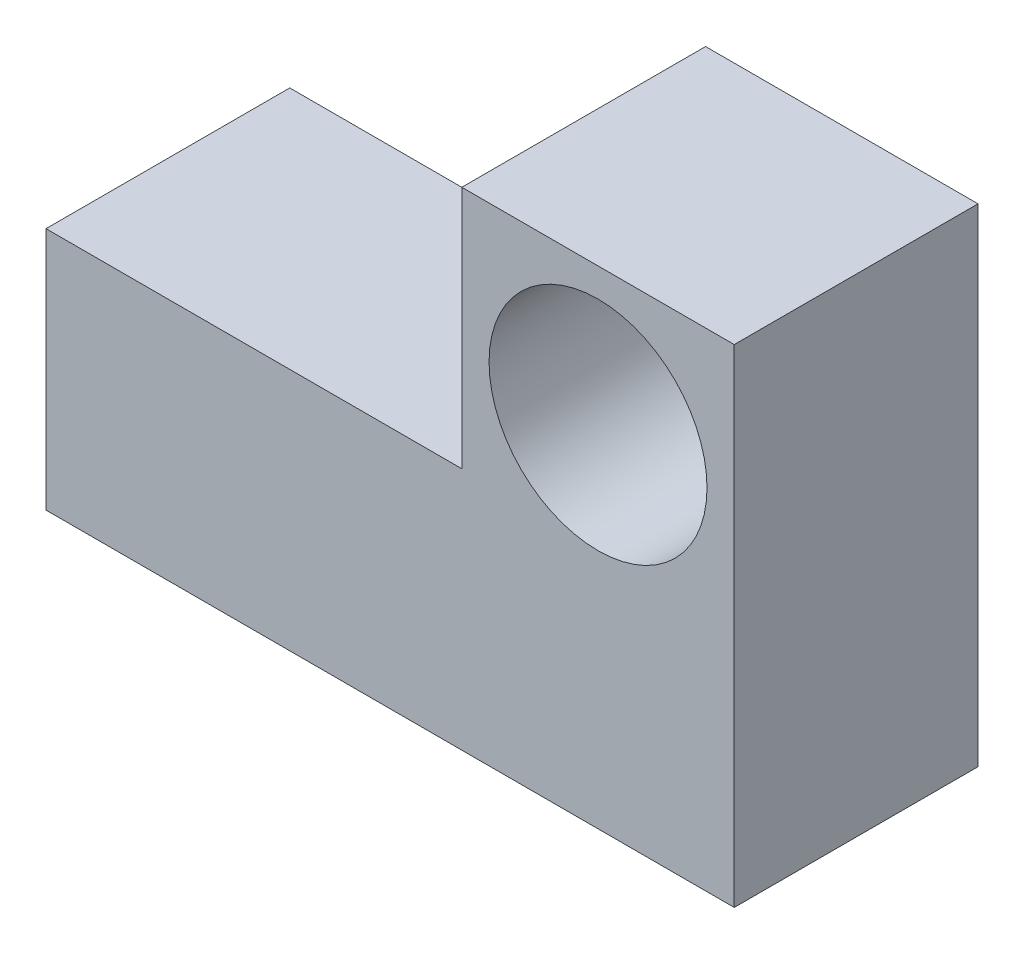
ISO-10303-21;
HEADER;
FILE_DESCRIPTION(('STEP AP214'),'2;1');
FILE_NAME('part.step','',(''),(''),'','','');
FILE_SCHEMA(('AUTOMOTIVE_DESIGN { 1 0 10303 214 1 1 1 1 }'));
ENDSEC;
DATA;
#1=APPLICATION_CONTEXT('core data for automotive mechanical design processes');
#2=APPLICATION_PROTOCOL_DEFINITION('international standard','automotive_design',2000,#1);
#3=PRODUCT_CONTEXT('',#1,'mechanical');
#4=PRODUCT('Part','Part','',(#3));
#5=PRODUCT_RELATED_PRODUCT_CATEGORY('part','',(#4));
#6=PRODUCT_DEFINITION_FORMATION('','',#4);
#7=PRODUCT_DEFINITION_CONTEXT('part definition',#1,'design');
#8=PRODUCT_DEFINITION('design','',#6,#7);
#9=PRODUCT_DEFINITION_SHAPE('','',#8);
#10=(LENGTH_UNIT() NAMED_UNIT(*) SI_UNIT(.MILLI.,.METRE.));
#11=(NAMED_UNIT(*) PLANE_ANGLE_UNIT() SI_UNIT($,.RADIAN.));
#12=(NAMED_UNIT(*) SI_UNIT($,.STERADIAN.) SOLID_ANGLE_UNIT());
#13=UNCERTAINTY_MEASURE_WITH_UNIT(LENGTH_MEASURE(1.E-05),#10,'distance_accuracy_value','');
#14=(GEOMETRIC_REPRESENTATION_CONTEXT(3) GLOBAL_UNCERTAINTY_ASSIGNED_CONTEXT((#13)) GLOBAL_UNIT_ASSIGNED_CONTEXT((#10,
#11,#12)) REPRESENTATION_CONTEXT('',''));
#15=CARTESIAN_POINT('',(0.,0.,0.));
#16=DIRECTION('',(0.,0.,1.));
#17=DIRECTION('',(1.,0.,0.));
#18=AXIS2_PLACEMENT_3D('',#15,#16,#17);
#19=CARTESIAN_POINT('',(0.,10.795,0.));
#20=DIRECTION('',(0.,-1.,0.));
#21=DIRECTION('',(0.,0.,-1.));
#22=AXIS2_PLACEMENT_3D('',#19,#20,#21);
#23=PLANE('',#22);
#24=DIRECTION('',(0.,0.,1.));
#25=VECTOR('',#24,1.);
#26=CARTESIAN_POINT('',(3.175,10.795,-5.3975));
#27=LINE('',#26,#25);
#28=CARTESIAN_POINT('',(3.17499999999999,10.795,-5.3975));
#29=VERTEX_POINT('',#28);
#30=CARTESIAN_POINT('',(3.175,10.795,5.3975));
#31=VERTEX_POINT('',#30);
#32=EDGE_CURVE('E49',#29,#31,#27,.T.);
#33=ORIENTED_EDGE('',*,*,#32,.F.);
#34=DIRECTION('',(-1.,0.,0.));
#35=VECTOR('',#34,1.);
#36=CARTESIAN_POINT('',(-15.24,10.795,-5.3975));
#37=LINE('',#36,#35);
#38=CARTESIAN_POINT('',(-15.24,10.795,-5.3975));
#39=VERTEX_POINT('',#38);
#40=EDGE_CURVE('E86',#29,#39,#37,.T.);
#41=ORIENTED_EDGE('',*,*,#40,.T.);
#42=DIRECTION('',(0.,0.,1.));
#43=VECTOR('',#42,1.);
#44=CARTESIAN_POINT('',(-15.24,10.795,5.3975));
#45=LINE('',#44,#43);
#46=CARTESIAN_POINT('',(-15.24,10.795,5.3975));
#47=VERTEX_POINT('',#46);
#48=EDGE_CURVE('E55',#39,#47,#45,.T.);
#49=ORIENTED_EDGE('',*,*,#48,.T.);
#50=DIRECTION('',(1.,0.,0.));
#51=VECTOR('',#50,1.);
#52=CARTESIAN_POINT('',(-15.24,10.795,5.3975));
#53=LINE('',#52,#51);
#54=EDGE_CURVE('E96',#47,#31,#53,.T.);
#55=ORIENTED_EDGE('',*,*,#54,.T.);
#56=EDGE_LOOP('',(#33,#41,#49,#55));
#57=FACE_BOUND('',#56,.T.);
#58=ADVANCED_FACE('F33',(#57),#23,.F.);
#59=CARTESIAN_POINT('',(15.24,10.795,5.3975));
#60=DIRECTION('',(-1.,0.,0.));
#61=DIRECTION('',(0.,0.,1.));
#62=AXIS2_PLACEMENT_3D('',#59,#60,#61);
#63=PLANE('',#62);
#64=DIRECTION('',(0.,0.,-1.));
#65=VECTOR('',#64,1.);
#66=CARTESIAN_POINT('',(15.24,0.,5.3975));
#67=LINE('',#66,#65);
#68=CARTESIAN_POINT('',(15.24,0.,5.3975));
#69=VERTEX_POINT('',#68);
#70=CARTESIAN_POINT('',(15.24,0.,-5.3975));
#71=VERTEX_POINT('',#70);
#72=EDGE_CURVE('E93',#69,#71,#67,.T.);
#73=ORIENTED_EDGE('',*,*,#72,.T.);
#74=DIRECTION('',(0.,-1.,0.));
#75=VECTOR('',#74,1.);
#76=CARTESIAN_POINT('',(15.24,10.795,-5.3975));
#77=LINE('',#76,#75);
#78=CARTESIAN_POINT('',(15.24,21.59,-5.3975));
#79=VERTEX_POINT('',#78);
#80=EDGE_CURVE('E11',#79,#71,#77,.T.);
#81=ORIENTED_EDGE('',*,*,#80,.F.);
#82=DIRECTION('',(0.,0.,-1.));
#83=VECTOR('',#82,1.);
#84=CARTESIAN_POINT('',(15.24,21.59,-5.3975));
#85=LINE('',#84,#83);
#86=CARTESIAN_POINT('',(15.24,21.59,5.3975));
#87=VERTEX_POINT('',#86);
#88=EDGE_CURVE('E95',#87,#79,#85,.T.);
#89=ORIENTED_EDGE('',*,*,#88,.F.);
#90=DIRECTION('',(0.,-1.,0.));
#91=VECTOR('',#90,1.);
#92=CARTESIAN_POINT('',(15.24,10.795,5.3975));
#93=LINE('',#92,#91);
#94=EDGE_CURVE('E79',#87,#69,#93,.T.);
#95=ORIENTED_EDGE('',*,*,#94,.T.);
#96=EDGE_LOOP('',(#73,#81,#89,#95));
#97=FACE_BOUND('',#96,.T.);
#98=ADVANCED_FACE('F35',(#97),#63,.F.);
#99=CARTESIAN_POINT('',(-15.24,10.795,-5.3975));
#100=DIRECTION('',(0.,0.,1.));
#101=DIRECTION('',(1.,0.,0.));
#102=AXIS2_PLACEMENT_3D('',#99,#100,#101);
#103=PLANE('',#102);
#104=CARTESIAN_POINT('',(9.2075,15.494,-5.3975));
#105=DIRECTION('',(0.,0.,-1.));
#106=DIRECTION('',(-1.,0.,0.));
#107=AXIS2_PLACEMENT_3D('',#104,#105,#106);
#108=CIRCLE('',#107,4.826);
#109=CARTESIAN_POINT('',(4.3815,15.494,-5.3975));
#110=VERTEX_POINT('',#109);
#111=EDGE_CURVE('E173',#110,#110,#108,.T.);
#112=ORIENTED_EDGE('',*,*,#111,.F.);
#113=EDGE_LOOP('',(#112));
#114=FACE_BOUND('',#113,.T.);
#115=DIRECTION('',(-1.,0.,0.));
#116=VECTOR('',#115,1.);
#117=CARTESIAN_POINT('',(-15.24,0.,-5.3975));
#118=LINE('',#117,#116);
#119=CARTESIAN_POINT('',(-15.24,0.,-5.3975));
#120=VERTEX_POINT('',#119);
#121=EDGE_CURVE('E99',#71,#120,#118,.T.);
#122=ORIENTED_EDGE('',*,*,#121,.T.);
#123=DIRECTION('',(0.,-1.,0.));
#124=VECTOR('',#123,1.);
#125=CARTESIAN_POINT('',(-15.24,10.795,-5.3975));
#126=LINE('',#125,#124);
#127=EDGE_CURVE('E42',#39,#120,#126,.T.);
#128=ORIENTED_EDGE('',*,*,#127,.F.);
#129=ORIENTED_EDGE('',*,*,#40,.F.);
#130=DIRECTION('',(0.,-1.,0.));
#131=VECTOR('',#130,1.);
#132=CARTESIAN_POINT('',(3.175,21.59,-5.3975));
#133=LINE('',#132,#131);
#134=CARTESIAN_POINT('',(3.175,21.59,-5.3975));
#135=VERTEX_POINT('',#134);
#136=EDGE_CURVE('E142',#135,#29,#133,.T.);
#137=ORIENTED_EDGE('',*,*,#136,.F.);
#138=DIRECTION('',(-1.,0.,0.));
#139=VECTOR('',#138,1.);
#140=CARTESIAN_POINT('',(3.175,21.59,-5.3975));
#141=LINE('',#140,#139);
#142=EDGE_CURVE('E122',#79,#135,#141,.T.);
#143=ORIENTED_EDGE('',*,*,#142,.F.);
#144=ORIENTED_EDGE('',*,*,#80,.T.);
#145=EDGE_LOOP('',(#122,#128,#129,#137,#143,#144));
#146=FACE_BOUND('',#145,.T.);
#147=ADVANCED_FACE('F116',(#114,#146),#103,.F.);
#148=CARTESIAN_POINT('',(-15.24,10.795,5.3975));
#149=DIRECTION('',(1.,0.,0.));
#150=DIRECTION('',(0.,0.,-1.));
#151=AXIS2_PLACEMENT_3D('',#148,#149,#150);
#152=PLANE('',#151);
#153=CARTESIAN_POINT('',(-15.24,5.3975,0.));
#154=DIRECTION('',(-1.,0.,0.));
#155=DIRECTION('',(0.,0.,1.));
#156=AXIS2_PLACEMENT_3D('',#153,#154,#155);
#157=CIRCLE('',#156,4.826);
#158=CARTESIAN_POINT('',(-15.24,5.3975,4.826));
#159=VERTEX_POINT('',#158);
#160=EDGE_CURVE('E104',#159,#159,#157,.T.);
#161=ORIENTED_EDGE('',*,*,#160,.F.);
#162=EDGE_LOOP('',(#161));
#163=FACE_BOUND('',#162,.T.);
#164=DIRECTION('',(0.,0.,1.));
#165=VECTOR('',#164,1.);
#166=CARTESIAN_POINT('',(-15.24,0.,5.3975));
#167=LINE('',#166,#165);
#168=CARTESIAN_POINT('',(-15.24,0.,5.3975));
#169=VERTEX_POINT('',#168);
#170=EDGE_CURVE('E87',#120,#169,#167,.T.);
#171=ORIENTED_EDGE('',*,*,#170,.T.);
#172=DIRECTION('',(0.,-1.,0.));
#173=VECTOR('',#172,1.);
#174=CARTESIAN_POINT('',(-15.24,10.795,5.3975));
#175=LINE('',#174,#173);
#176=EDGE_CURVE('E82',#47,#169,#175,.T.);
#177=ORIENTED_EDGE('',*,*,#176,.F.);
#178=ORIENTED_EDGE('',*,*,#48,.F.);
#179=ORIENTED_EDGE('',*,*,#127,.T.);
#180=EDGE_LOOP('',(#171,#177,#178,#179));
#181=FACE_BOUND('',#180,.T.);
#182=ADVANCED_FACE('F114',(#163,#181),#152,.F.);
#183=CARTESIAN_POINT('',(-15.24,10.795,5.3975));
#184=DIRECTION('',(0.,0.,-1.));
#185=DIRECTION('',(-1.,0.,0.));
#186=AXIS2_PLACEMENT_3D('',#183,#184,#185);
#187=PLANE('',#186);
#188=CARTESIAN_POINT('',(9.2075,15.494,5.3975));
#189=DIRECTION('',(0.,0.,-1.));
#190=DIRECTION('',(-1.,0.,0.));
#191=AXIS2_PLACEMENT_3D('',#188,#189,#190);
#192=CIRCLE('',#191,4.826);
#193=CARTESIAN_POINT('',(4.3815,15.494,5.3975));
#194=VERTEX_POINT('',#193);
#195=EDGE_CURVE('E37',#194,#194,#192,.T.);
#196=ORIENTED_EDGE('',*,*,#195,.T.);
#197=EDGE_LOOP('',(#196));
#198=FACE_BOUND('',#197,.T.);
#199=DIRECTION('',(1.,0.,0.));
#200=VECTOR('',#199,1.);
#201=CARTESIAN_POINT('',(-15.24,0.,5.3975));
#202=LINE('',#201,#200);
#203=EDGE_CURVE('E75',#169,#69,#202,.T.);
#204=ORIENTED_EDGE('',*,*,#203,.T.);
#205=ORIENTED_EDGE('',*,*,#94,.F.);
#206=DIRECTION('',(1.,0.,0.));
#207=VECTOR('',#206,1.);
#208=CARTESIAN_POINT('',(3.175,21.59,5.3975));
#209=LINE('',#208,#207);
#210=CARTESIAN_POINT('',(3.175,21.59,5.3975));
#211=VERTEX_POINT('',#210);
#212=EDGE_CURVE('E136',#211,#87,#209,.T.);
#213=ORIENTED_EDGE('',*,*,#212,.F.);
#214=DIRECTION('',(0.,-1.,0.));
#215=VECTOR('',#214,1.);
#216=CARTESIAN_POINT('',(3.175,21.59,5.3975));
#217=LINE('',#216,#215);
#218=EDGE_CURVE('E140',#211,#31,#217,.T.);
#219=ORIENTED_EDGE('',*,*,#218,.T.);
#220=ORIENTED_EDGE('',*,*,#54,.F.);
#221=ORIENTED_EDGE('',*,*,#176,.T.);
#222=EDGE_LOOP('',(#204,#205,#213,#219,#220,#221));
#223=FACE_BOUND('',#222,.T.);
#224=ADVANCED_FACE('F77',(#198,#223),#187,.F.);
#225=CARTESIAN_POINT('',(0.,0.,0.));
#226=DIRECTION('',(0.,-1.,0.));
#227=DIRECTION('',(0.,0.,-1.));
#228=AXIS2_PLACEMENT_3D('',#225,#226,#227);
#229=PLANE('',#228);
#230=ORIENTED_EDGE('',*,*,#72,.F.);
#231=ORIENTED_EDGE('',*,*,#203,.F.);
#232=ORIENTED_EDGE('',*,*,#170,.F.);
#233=ORIENTED_EDGE('',*,*,#121,.F.);
#234=EDGE_LOOP('',(#230,#231,#232,#233));
#235=FACE_BOUND('',#234,.T.);
#236=ADVANCED_FACE('F98',(#235),#229,.T.);
#237=CARTESIAN_POINT('',(11.43,5.3975,0.));
#238=DIRECTION('',(-1.,0.,0.));
#239=DIRECTION('',(0.,0.,1.));
#240=AXIS2_PLACEMENT_3D('',#237,#238,#239);
#241=CYLINDRICAL_SURFACE('',#240,4.826);
#242=CARTESIAN_POINT('',(11.43,5.3975,0.));
#243=DIRECTION('',(-1.,0.,0.));
#244=DIRECTION('',(0.,0.,1.));
#245=AXIS2_PLACEMENT_3D('',#242,#243,#244);
#246=CIRCLE('',#245,4.826);
#247=CARTESIAN_POINT('',(11.43,5.3975,4.826));
#248=VERTEX_POINT('',#247);
#249=EDGE_CURVE('E100',#248,#248,#246,.T.);
#250=ORIENTED_EDGE('',*,*,#249,.F.);
#251=EDGE_LOOP('',(#250));
#252=FACE_BOUND('',#251,.T.);
#253=ORIENTED_EDGE('',*,*,#160,.T.);
#254=EDGE_LOOP('',(#253));
#255=FACE_BOUND('',#254,.T.);
#256=ADVANCED_FACE('F158',(#252,#255),#241,.F.);
#257=CARTESIAN_POINT('',(11.43,5.3975,0.));
#258=DIRECTION('',(-1.,0.,0.));
#259=DIRECTION('',(0.,0.,1.));
#260=AXIS2_PLACEMENT_3D('',#257,#258,#259);
#261=PLANE('',#260);
#262=ORIENTED_EDGE('',*,*,#249,.T.);
#263=EDGE_LOOP('',(#262));
#264=FACE_BOUND('',#263,.T.);
#265=ADVANCED_FACE('F189',(#264),#261,.T.);
#266=CARTESIAN_POINT('',(3.175,21.59,-5.3975));
#267=DIRECTION('',(1.,0.,0.));
#268=DIRECTION('',(0.,0.,-1.));
#269=AXIS2_PLACEMENT_3D('',#266,#267,#268);
#270=PLANE('',#269);
#271=ORIENTED_EDGE('',*,*,#32,.T.);
#272=ORIENTED_EDGE('',*,*,#218,.F.);
#273=DIRECTION('',(0.,0.,1.));
#274=VECTOR('',#273,1.);
#275=CARTESIAN_POINT('',(3.175,21.59,-5.3975));
#276=LINE('',#275,#274);
#277=EDGE_CURVE('E133',#135,#211,#276,.T.);
#278=ORIENTED_EDGE('',*,*,#277,.F.);
#279=ORIENTED_EDGE('',*,*,#136,.T.);
#280=EDGE_LOOP('',(#271,#272,#278,#279));
#281=FACE_BOUND('',#280,.T.);
#282=ADVANCED_FACE('F141',(#281),#270,.F.);
#283=CARTESIAN_POINT('',(0.,21.59,0.));
#284=DIRECTION('',(0.,1.,0.));
#285=DIRECTION('',(0.,0.,1.));
#286=AXIS2_PLACEMENT_3D('',#283,#284,#285);
#287=PLANE('',#286);
#288=ORIENTED_EDGE('',*,*,#88,.T.);
#289=ORIENTED_EDGE('',*,*,#142,.T.);
#290=ORIENTED_EDGE('',*,*,#277,.T.);
#291=ORIENTED_EDGE('',*,*,#212,.T.);
#292=EDGE_LOOP('',(#288,#289,#290,#291));
#293=FACE_BOUND('',#292,.T.);
#294=ADVANCED_FACE('F135',(#293),#287,.T.);
#295=CARTESIAN_POINT('',(9.2075,15.494,20.0025));
#296=DIRECTION('',(0.,0.,-1.));
#297=DIRECTION('',(-1.,0.,0.));
#298=AXIS2_PLACEMENT_3D('',#295,#296,#297);
#299=CYLINDRICAL_SURFACE('',#298,4.826);
#300=ORIENTED_EDGE('',*,*,#111,.T.);
#301=EDGE_LOOP('',(#300));
#302=FACE_BOUND('',#301,.T.);
#303=ORIENTED_EDGE('',*,*,#195,.F.);
#304=EDGE_LOOP('',(#303));
#305=FACE_BOUND('',#304,.T.);
#306=ADVANCED_FACE('F180',(#302,#305),#299,.F.);
#307=CLOSED_SHELL('',(#58,#98,#147,#182,#224,#236,#256,#265,#282,#294,#306));
#308=MANIFOLD_SOLID_BREP('B2',#307);
#309=ADVANCED_BREP_SHAPE_REPRESENTATION('',(#18,#308),#14);
#310=SHAPE_DEFINITION_REPRESENTATION(#9,#309);
ENDSEC;
END-ISO-10303-21;
